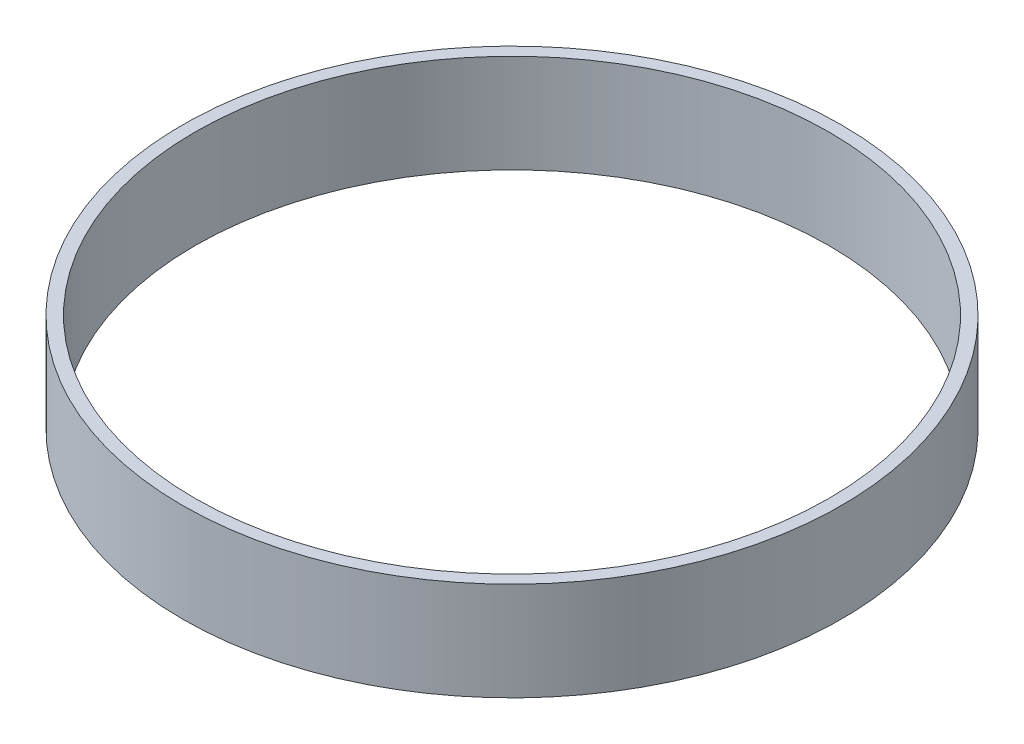
ISO-10303-21;
HEADER;
FILE_DESCRIPTION(('STEP AP214'),'2;1');
FILE_NAME('part.step','',(''),(''),'','','');
FILE_SCHEMA(('AUTOMOTIVE_DESIGN { 1 0 10303 214 1 1 1 1 }'));
ENDSEC;
DATA;
#1=APPLICATION_CONTEXT('core data for automotive mechanical design processes');
#2=APPLICATION_PROTOCOL_DEFINITION('international standard','automotive_design',2000,#1);
#3=PRODUCT_CONTEXT('',#1,'mechanical');
#4=PRODUCT('Part','Part','',(#3));
#5=PRODUCT_RELATED_PRODUCT_CATEGORY('part','',(#4));
#6=PRODUCT_DEFINITION_FORMATION('','',#4);
#7=PRODUCT_DEFINITION_CONTEXT('part definition',#1,'design');
#8=PRODUCT_DEFINITION('design','',#6,#7);
#9=PRODUCT_DEFINITION_SHAPE('','',#8);
#10=(LENGTH_UNIT() NAMED_UNIT(*) SI_UNIT(.MILLI.,.METRE.));
#11=(NAMED_UNIT(*) PLANE_ANGLE_UNIT() SI_UNIT($,.RADIAN.));
#12=(NAMED_UNIT(*) SI_UNIT($,.STERADIAN.) SOLID_ANGLE_UNIT());
#13=UNCERTAINTY_MEASURE_WITH_UNIT(LENGTH_MEASURE(1.E-05),#10,'distance_accuracy_value','');
#14=(GEOMETRIC_REPRESENTATION_CONTEXT(3) GLOBAL_UNCERTAINTY_ASSIGNED_CONTEXT((#13)) GLOBAL_UNIT_ASSIGNED_CONTEXT((#10,
#11,#12)) REPRESENTATION_CONTEXT('',''));
#15=CARTESIAN_POINT('',(0.,0.,0.));
#16=DIRECTION('',(0.,0.,1.));
#17=DIRECTION('',(1.,0.,0.));
#18=AXIS2_PLACEMENT_3D('',#15,#16,#17);
#19=CARTESIAN_POINT('',(0.,0.,0.));
#20=DIRECTION('',(0.,-1.,0.));
#21=DIRECTION('',(0.,0.,-1.));
#22=AXIS2_PLACEMENT_3D('',#19,#20,#21);
#23=CYLINDRICAL_SURFACE('',#22,95.25);
#24=CARTESIAN_POINT('',(0.,28.448,0.));
#25=DIRECTION('',(0.,-1.,0.));
#26=DIRECTION('',(0.,0.,-1.));
#27=AXIS2_PLACEMENT_3D('',#24,#25,#26);
#28=CIRCLE('',#27,95.25);
#29=CARTESIAN_POINT('',(0.,28.448,-95.25));
#30=VERTEX_POINT('',#29);
#31=EDGE_CURVE('E10',#30,#30,#28,.T.);
#32=ORIENTED_EDGE('',*,*,#31,.T.);
#33=EDGE_LOOP('',(#32));
#34=FACE_BOUND('',#33,.T.);
#35=CARTESIAN_POINT('',(0.,0.,0.));
#36=DIRECTION('',(0.,-1.,0.));
#37=DIRECTION('',(0.,0.,-1.));
#38=AXIS2_PLACEMENT_3D('',#35,#36,#37);
#39=CIRCLE('',#38,95.25);
#40=CARTESIAN_POINT('',(0.,0.,-95.25));
#41=VERTEX_POINT('',#40);
#42=EDGE_CURVE('E45',#41,#41,#39,.T.);
#43=ORIENTED_EDGE('',*,*,#42,.F.);
#44=EDGE_LOOP('',(#43));
#45=FACE_BOUND('',#44,.T.);
#46=ADVANCED_FACE('F31',(#34,#45),#23,.T.);
#47=CARTESIAN_POINT('',(95.25,28.448,0.));
#48=DIRECTION('',(0.,1.,0.));
#49=DIRECTION('',(0.,0.,1.));
#50=AXIS2_PLACEMENT_3D('',#47,#48,#49);
#51=PLANE('',#50);
#52=CARTESIAN_POINT('',(0.,28.448,0.));
#53=DIRECTION('',(0.,-1.,0.));
#54=DIRECTION('',(0.,0.,-1.));
#55=AXIS2_PLACEMENT_3D('',#52,#53,#54);
#56=CIRCLE('',#55,91.6634326647564);
#57=CARTESIAN_POINT('',(0.,28.448,-91.6634326647564));
#58=VERTEX_POINT('',#57);
#59=EDGE_CURVE('E37',#58,#58,#56,.T.);
#60=ORIENTED_EDGE('',*,*,#59,.T.);
#61=EDGE_LOOP('',(#60));
#62=FACE_BOUND('',#61,.T.);
#63=ORIENTED_EDGE('',*,*,#31,.F.);
#64=EDGE_LOOP('',(#63));
#65=FACE_BOUND('',#64,.T.);
#66=ADVANCED_FACE('F55',(#62,#65),#51,.T.);
#67=CARTESIAN_POINT('',(0.,0.,0.));
#68=DIRECTION('',(0.,-1.,0.));
#69=DIRECTION('',(0.,0.,-1.));
#70=AXIS2_PLACEMENT_3D('',#67,#68,#69);
#71=CYLINDRICAL_SURFACE('',#70,91.6634326647564);
#72=CARTESIAN_POINT('',(0.,0.,0.));
#73=DIRECTION('',(0.,-1.,0.));
#74=DIRECTION('',(0.,0.,-1.));
#75=AXIS2_PLACEMENT_3D('',#72,#73,#74);
#76=CIRCLE('',#75,91.6634326647564);
#77=CARTESIAN_POINT('',(0.,0.,-91.6634326647564));
#78=VERTEX_POINT('',#77);
#79=EDGE_CURVE('E41',#78,#78,#76,.T.);
#80=ORIENTED_EDGE('',*,*,#79,.T.);
#81=EDGE_LOOP('',(#80));
#82=FACE_BOUND('',#81,.T.);
#83=ORIENTED_EDGE('',*,*,#59,.F.);
#84=EDGE_LOOP('',(#83));
#85=FACE_BOUND('',#84,.T.);
#86=ADVANCED_FACE('F59',(#82,#85),#71,.F.);
#87=CARTESIAN_POINT('',(95.25,0.,0.));
#88=DIRECTION('',(0.,-1.,0.));
#89=DIRECTION('',(0.,0.,-1.));
#90=AXIS2_PLACEMENT_3D('',#87,#88,#89);
#91=PLANE('',#90);
#92=ORIENTED_EDGE('',*,*,#42,.T.);
#93=EDGE_LOOP('',(#92));
#94=FACE_BOUND('',#93,.T.);
#95=ORIENTED_EDGE('',*,*,#79,.F.);
#96=EDGE_LOOP('',(#95));
#97=FACE_BOUND('',#96,.T.);
#98=ADVANCED_FACE('F51',(#94,#97),#91,.T.);
#99=CLOSED_SHELL('',(#46,#66,#86,#98));
#100=MANIFOLD_SOLID_BREP('B2',#99);
#101=ADVANCED_BREP_SHAPE_REPRESENTATION('',(#18,#100),#14);
#102=SHAPE_DEFINITION_REPRESENTATION(#9,#101);
ENDSEC;
END-ISO-10303-21;
